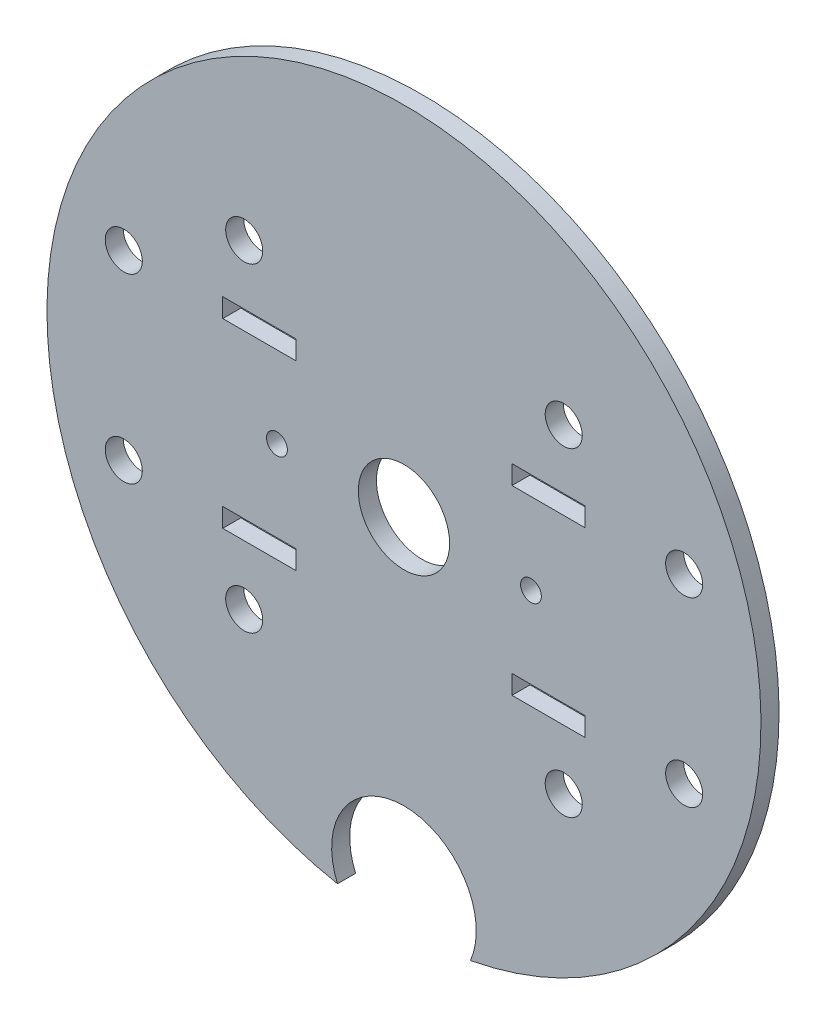
ISO-10303-21;
HEADER;
FILE_DESCRIPTION(('STEP AP214'),'2;1');
FILE_NAME('part.step','',(''),(''),'','','');
FILE_SCHEMA(('AUTOMOTIVE_DESIGN { 1 0 10303 214 1 1 1 1 }'));
ENDSEC;
DATA;
#1=APPLICATION_CONTEXT('core data for automotive mechanical design processes');
#2=APPLICATION_PROTOCOL_DEFINITION('international standard','automotive_design',2000,#1);
#3=PRODUCT_CONTEXT('',#1,'mechanical');
#4=PRODUCT('Part','Part','',(#3));
#5=PRODUCT_RELATED_PRODUCT_CATEGORY('part','',(#4));
#6=PRODUCT_DEFINITION_FORMATION('','',#4);
#7=PRODUCT_DEFINITION_CONTEXT('part definition',#1,'design');
#8=PRODUCT_DEFINITION('design','',#6,#7);
#9=PRODUCT_DEFINITION_SHAPE('','',#8);
#10=(LENGTH_UNIT() NAMED_UNIT(*) SI_UNIT(.MILLI.,.METRE.));
#11=(NAMED_UNIT(*) PLANE_ANGLE_UNIT() SI_UNIT($,.RADIAN.));
#12=(NAMED_UNIT(*) SI_UNIT($,.STERADIAN.) SOLID_ANGLE_UNIT());
#13=UNCERTAINTY_MEASURE_WITH_UNIT(LENGTH_MEASURE(1.E-05),#10,'distance_accuracy_value','');
#14=(GEOMETRIC_REPRESENTATION_CONTEXT(3) GLOBAL_UNCERTAINTY_ASSIGNED_CONTEXT((#13)) GLOBAL_UNIT_ASSIGNED_CONTEXT((#10,
#11,#12)) REPRESENTATION_CONTEXT('',''));
#15=CARTESIAN_POINT('',(0.,0.,0.));
#16=DIRECTION('',(0.,0.,1.));
#17=DIRECTION('',(1.,0.,0.));
#18=AXIS2_PLACEMENT_3D('',#15,#16,#17);
#19=CARTESIAN_POINT('',(0.,-17.8310405714632,2.));
#20=DIRECTION('',(0.,0.,-1.));
#21=DIRECTION('',(-1.,0.,0.));
#22=AXIS2_PLACEMENT_3D('',#19,#20,#21);
#23=PLANE('',#22);
#24=DIRECTION('',(-1.,0.,0.));
#25=VECTOR('',#24,1.);
#26=CARTESIAN_POINT('',(-11.95,11.1,2.));
#27=LINE('',#26,#25);
#28=CARTESIAN_POINT('',(-11.95,11.1,2.));
#29=VERTEX_POINT('',#28);
#30=CARTESIAN_POINT('',(-20.05,11.1,2.));
#31=VERTEX_POINT('',#30);
#32=EDGE_CURVE('E200',#29,#31,#27,.T.);
#33=ORIENTED_EDGE('',*,*,#32,.F.);
#34=DIRECTION('',(0.,1.,0.));
#35=VECTOR('',#34,1.);
#36=CARTESIAN_POINT('',(-11.95,11.1,2.));
#37=LINE('',#36,#35);
#38=CARTESIAN_POINT('',(-11.95,9.,2.));
#39=VERTEX_POINT('',#38);
#40=EDGE_CURVE('E208',#39,#29,#37,.T.);
#41=ORIENTED_EDGE('',*,*,#40,.F.);
#42=DIRECTION('',(1.,0.,0.));
#43=VECTOR('',#42,1.);
#44=CARTESIAN_POINT('',(-11.95,9.,2.));
#45=LINE('',#44,#43);
#46=CARTESIAN_POINT('',(-20.05,9.,2.));
#47=VERTEX_POINT('',#46);
#48=EDGE_CURVE('E205',#47,#39,#45,.T.);
#49=ORIENTED_EDGE('',*,*,#48,.F.);
#50=DIRECTION('',(0.,-1.,0.));
#51=VECTOR('',#50,1.);
#52=CARTESIAN_POINT('',(-20.05,11.1,2.));
#53=LINE('',#52,#51);
#54=EDGE_CURVE('E202',#31,#47,#53,.T.);
#55=ORIENTED_EDGE('',*,*,#54,.F.);
#56=EDGE_LOOP('',(#33,#41,#49,#55));
#57=FACE_BOUND('',#56,.T.);
#58=CARTESIAN_POINT('',(-17.6776695296637,-17.6776695296637,2.));
#59=DIRECTION('',(0.,0.,1.));
#60=DIRECTION('',(1.,0.,0.));
#61=AXIS2_PLACEMENT_3D('',#58,#59,#60);
#62=CIRCLE('',#61,2.05);
#63=CARTESIAN_POINT('',(-15.6276695296637,-17.6776695296637,2.));
#64=VERTEX_POINT('',#63);
#65=EDGE_CURVE('E280',#64,#64,#62,.T.);
#66=ORIENTED_EDGE('',*,*,#65,.F.);
#67=EDGE_LOOP('',(#66));
#68=FACE_BOUND('',#67,.T.);
#69=CARTESIAN_POINT('',(0.,0.,2.));
#70=DIRECTION('',(0.,0.,1.));
#71=DIRECTION('',(1.,0.,0.));
#72=AXIS2_PLACEMENT_3D('',#69,#70,#71);
#73=CIRCLE('',#72,5.05);
#74=CARTESIAN_POINT('',(5.05,0.,2.));
#75=VERTEX_POINT('',#74);
#76=EDGE_CURVE('E286',#75,#75,#73,.T.);
#77=ORIENTED_EDGE('',*,*,#76,.F.);
#78=EDGE_LOOP('',(#77));
#79=FACE_BOUND('',#78,.T.);
#80=DIRECTION('',(1.,0.,0.));
#81=VECTOR('',#80,1.);
#82=CARTESIAN_POINT('',(11.95,-11.1,2.));
#83=LINE('',#82,#81);
#84=CARTESIAN_POINT('',(11.95,-11.1,2.));
#85=VERTEX_POINT('',#84);
#86=CARTESIAN_POINT('',(20.05,-11.1,2.));
#87=VERTEX_POINT('',#86);
#88=EDGE_CURVE('E292',#85,#87,#83,.T.);
#89=ORIENTED_EDGE('',*,*,#88,.F.);
#90=DIRECTION('',(0.,-1.,0.));
#91=VECTOR('',#90,1.);
#92=CARTESIAN_POINT('',(11.95,-11.1,2.));
#93=LINE('',#92,#91);
#94=CARTESIAN_POINT('',(11.95,-9.,2.));
#95=VERTEX_POINT('',#94);
#96=EDGE_CURVE('E300',#95,#85,#93,.T.);
#97=ORIENTED_EDGE('',*,*,#96,.F.);
#98=DIRECTION('',(-1.,0.,0.));
#99=VECTOR('',#98,1.);
#100=CARTESIAN_POINT('',(11.95,-9.,2.));
#101=LINE('',#100,#99);
#102=CARTESIAN_POINT('',(20.05,-9.,2.));
#103=VERTEX_POINT('',#102);
#104=EDGE_CURVE('E297',#103,#95,#101,.T.);
#105=ORIENTED_EDGE('',*,*,#104,.F.);
#106=DIRECTION('',(0.,1.,0.));
#107=VECTOR('',#106,1.);
#108=CARTESIAN_POINT('',(20.05,-11.1,2.));
#109=LINE('',#108,#107);
#110=EDGE_CURVE('E294',#87,#103,#109,.T.);
#111=ORIENTED_EDGE('',*,*,#110,.F.);
#112=EDGE_LOOP('',(#89,#97,#105,#111));
#113=FACE_BOUND('',#112,.T.);
#114=CARTESIAN_POINT('',(0.,-35.6620811429264,2.));
#115=DIRECTION('',(0.,0.,-1.));
#116=DIRECTION('',(-1.,0.,0.));
#117=AXIS2_PLACEMENT_3D('',#114,#115,#116);
#118=CIRCLE('',#117,8.);
#119=CARTESIAN_POINT('',(-7.35497190989704,-38.8092049416711,2.));
#120=VERTEX_POINT('',#119);
#121=CARTESIAN_POINT('',(7.35497190989709,-38.8092049416711,2.));
#122=VERTEX_POINT('',#121);
#123=EDGE_CURVE('E323',#120,#122,#118,.T.);
#124=ORIENTED_EDGE('',*,*,#123,.T.);
#125=CARTESIAN_POINT('',(0.,0.,2.));
#126=DIRECTION('',(0.,0.,1.));
#127=DIRECTION('',(-1.,0.,0.));
#128=AXIS2_PLACEMENT_3D('',#125,#126,#127);
#129=CIRCLE('',#128,39.5);
#130=EDGE_CURVE('E326',#122,#120,#129,.T.);
#131=ORIENTED_EDGE('',*,*,#130,.T.);
#132=EDGE_LOOP('',(#124,#131));
#133=FACE_BOUND('',#132,.T.);
#134=DIRECTION('',(0.,1.,0.));
#135=VECTOR('',#134,1.);
#136=CARTESIAN_POINT('',(20.05,11.1,2.));
#137=LINE('',#136,#135);
#138=CARTESIAN_POINT('',(20.05,9.,2.));
#139=VERTEX_POINT('',#138);
#140=CARTESIAN_POINT('',(20.05,11.1,2.));
#141=VERTEX_POINT('',#140);
#142=EDGE_CURVE('E249',#139,#141,#137,.T.);
#143=ORIENTED_EDGE('',*,*,#142,.F.);
#144=DIRECTION('',(1.,0.,0.));
#145=VECTOR('',#144,1.);
#146=CARTESIAN_POINT('',(11.95,9.,2.));
#147=LINE('',#146,#145);
#148=CARTESIAN_POINT('',(11.95,9.,2.));
#149=VERTEX_POINT('',#148);
#150=EDGE_CURVE('E257',#149,#139,#147,.T.);
#151=ORIENTED_EDGE('',*,*,#150,.F.);
#152=DIRECTION('',(0.,-1.,0.));
#153=VECTOR('',#152,1.);
#154=CARTESIAN_POINT('',(11.95,11.1,2.));
#155=LINE('',#154,#153);
#156=CARTESIAN_POINT('',(11.95,11.1,2.));
#157=VERTEX_POINT('',#156);
#158=EDGE_CURVE('E254',#157,#149,#155,.T.);
#159=ORIENTED_EDGE('',*,*,#158,.F.);
#160=DIRECTION('',(-1.,0.,0.));
#161=VECTOR('',#160,1.);
#162=CARTESIAN_POINT('',(11.95,11.1,2.));
#163=LINE('',#162,#161);
#164=EDGE_CURVE('E251',#141,#157,#163,.T.);
#165=ORIENTED_EDGE('',*,*,#164,.F.);
#166=EDGE_LOOP('',(#143,#151,#159,#165));
#167=FACE_BOUND('',#166,.T.);
#168=CARTESIAN_POINT('',(-17.6776695296637,17.6776695296637,2.));
#169=DIRECTION('',(0.,0.,1.));
#170=DIRECTION('',(1.,0.,0.));
#171=AXIS2_PLACEMENT_3D('',#168,#169,#170);
#172=CIRCLE('',#171,2.05);
#173=CARTESIAN_POINT('',(-15.6276695296637,17.6776695296637,2.));
#174=VERTEX_POINT('',#173);
#175=EDGE_CURVE('E243',#174,#174,#172,.T.);
#176=ORIENTED_EDGE('',*,*,#175,.F.);
#177=EDGE_LOOP('',(#176));
#178=FACE_BOUND('',#177,.T.);
#179=CARTESIAN_POINT('',(17.6776695296637,17.6776695296637,2.));
#180=DIRECTION('',(0.,0.,1.));
#181=DIRECTION('',(1.,0.,0.));
#182=AXIS2_PLACEMENT_3D('',#179,#180,#181);
#183=CIRCLE('',#182,2.05);
#184=CARTESIAN_POINT('',(19.7276695296637,17.6776695296637,2.));
#185=VERTEX_POINT('',#184);
#186=EDGE_CURVE('E237',#185,#185,#183,.T.);
#187=ORIENTED_EDGE('',*,*,#186,.F.);
#188=EDGE_LOOP('',(#187));
#189=FACE_BOUND('',#188,.T.);
#190=CARTESIAN_POINT('',(17.6776695296637,-17.6776695296637,2.));
#191=DIRECTION('',(0.,0.,1.));
#192=DIRECTION('',(1.,0.,0.));
#193=AXIS2_PLACEMENT_3D('',#190,#191,#192);
#194=CIRCLE('',#193,2.05);
#195=CARTESIAN_POINT('',(19.7276695296637,-17.6776695296637,2.));
#196=VERTEX_POINT('',#195);
#197=EDGE_CURVE('E231',#196,#196,#194,.T.);
#198=ORIENTED_EDGE('',*,*,#197,.F.);
#199=EDGE_LOOP('',(#198));
#200=FACE_BOUND('',#199,.T.);
#201=DIRECTION('',(1.,0.,0.));
#202=VECTOR('',#201,1.);
#203=CARTESIAN_POINT('',(-11.95,-11.1,2.));
#204=LINE('',#203,#202);
#205=CARTESIAN_POINT('',(-20.05,-11.1,2.));
#206=VERTEX_POINT('',#205);
#207=CARTESIAN_POINT('',(-11.95,-11.1,2.));
#208=VERTEX_POINT('',#207);
#209=EDGE_CURVE('E161',#206,#208,#204,.T.);
#210=ORIENTED_EDGE('',*,*,#209,.F.);
#211=DIRECTION('',(0.,-1.,0.));
#212=VECTOR('',#211,1.);
#213=CARTESIAN_POINT('',(-20.05,-11.1,2.));
#214=LINE('',#213,#212);
#215=CARTESIAN_POINT('',(-20.05,-9.,2.));
#216=VERTEX_POINT('',#215);
#217=EDGE_CURVE('E184',#216,#206,#214,.T.);
#218=ORIENTED_EDGE('',*,*,#217,.F.);
#219=DIRECTION('',(-1.,0.,0.));
#220=VECTOR('',#219,1.);
#221=CARTESIAN_POINT('',(-11.95,-9.,2.));
#222=LINE('',#221,#220);
#223=CARTESIAN_POINT('',(-11.95,-9.,2.));
#224=VERTEX_POINT('',#223);
#225=EDGE_CURVE('E182',#224,#216,#222,.T.);
#226=ORIENTED_EDGE('',*,*,#225,.F.);
#227=DIRECTION('',(0.,1.,0.));
#228=VECTOR('',#227,1.);
#229=CARTESIAN_POINT('',(-11.95,-11.1,2.));
#230=LINE('',#229,#228);
#231=EDGE_CURVE('E169',#208,#224,#230,.T.);
#232=ORIENTED_EDGE('',*,*,#231,.F.);
#233=EDGE_LOOP('',(#210,#218,#226,#232));
#234=FACE_BOUND('',#233,.T.);
#235=CARTESIAN_POINT('',(31.,10.05,2.));
#236=DIRECTION('',(0.,0.,1.));
#237=DIRECTION('',(1.,0.,0.));
#238=AXIS2_PLACEMENT_3D('',#235,#236,#237);
#239=CIRCLE('',#238,2.04999999999999);
#240=CARTESIAN_POINT('',(33.05,10.05,2.));
#241=VERTEX_POINT('',#240);
#242=EDGE_CURVE('E190',#241,#241,#239,.T.);
#243=ORIENTED_EDGE('',*,*,#242,.F.);
#244=EDGE_LOOP('',(#243));
#245=FACE_BOUND('',#244,.T.);
#246=CARTESIAN_POINT('',(31.,-10.05,2.));
#247=DIRECTION('',(0.,0.,1.));
#248=DIRECTION('',(-1.,0.,0.));
#249=AXIS2_PLACEMENT_3D('',#246,#247,#248);
#250=CIRCLE('',#249,2.04999999999999);
#251=CARTESIAN_POINT('',(28.95,-10.05,2.));
#252=VERTEX_POINT('',#251);
#253=EDGE_CURVE('E405',#252,#252,#250,.T.);
#254=ORIENTED_EDGE('',*,*,#253,.F.);
#255=EDGE_LOOP('',(#254));
#256=FACE_BOUND('',#255,.T.);
#257=CARTESIAN_POINT('',(-31.,-10.05,2.));
#258=DIRECTION('',(0.,0.,1.));
#259=DIRECTION('',(1.,0.,0.));
#260=AXIS2_PLACEMENT_3D('',#257,#258,#259);
#261=CIRCLE('',#260,2.04999999999999);
#262=CARTESIAN_POINT('',(-28.95,-10.05,2.));
#263=VERTEX_POINT('',#262);
#264=EDGE_CURVE('E400',#263,#263,#261,.T.);
#265=ORIENTED_EDGE('',*,*,#264,.F.);
#266=EDGE_LOOP('',(#265));
#267=FACE_BOUND('',#266,.T.);
#268=CARTESIAN_POINT('',(-31.,10.05,2.));
#269=DIRECTION('',(0.,0.,1.));
#270=DIRECTION('',(-1.,0.,0.));
#271=AXIS2_PLACEMENT_3D('',#268,#269,#270);
#272=CIRCLE('',#271,2.04999999999999);
#273=CARTESIAN_POINT('',(-33.05,10.05,2.));
#274=VERTEX_POINT('',#273);
#275=EDGE_CURVE('E395',#274,#274,#272,.T.);
#276=ORIENTED_EDGE('',*,*,#275,.F.);
#277=EDGE_LOOP('',(#276));
#278=FACE_BOUND('',#277,.T.);
#279=CARTESIAN_POINT('',(-14.05,0.,2.));
#280=DIRECTION('',(0.,0.,1.));
#281=DIRECTION('',(1.,0.,0.));
#282=AXIS2_PLACEMENT_3D('',#279,#280,#281);
#283=CIRCLE('',#282,1.15);
#284=CARTESIAN_POINT('',(-12.9,0.,2.));
#285=VERTEX_POINT('',#284);
#286=EDGE_CURVE('E390',#285,#285,#283,.T.);
#287=ORIENTED_EDGE('',*,*,#286,.F.);
#288=EDGE_LOOP('',(#287));
#289=FACE_BOUND('',#288,.T.);
#290=CARTESIAN_POINT('',(14.05,0.,2.));
#291=DIRECTION('',(0.,0.,1.));
#292=DIRECTION('',(1.,0.,0.));
#293=AXIS2_PLACEMENT_3D('',#290,#291,#292);
#294=CIRCLE('',#293,1.15);
#295=CARTESIAN_POINT('',(15.2,0.,2.));
#296=VERTEX_POINT('',#295);
#297=EDGE_CURVE('E384',#296,#296,#294,.T.);
#298=ORIENTED_EDGE('',*,*,#297,.F.);
#299=EDGE_LOOP('',(#298));
#300=FACE_BOUND('',#299,.T.);
#301=ADVANCED_FACE('F36',(#57,#68,#79,#113,#133,#167,#178,#189,#200,#234,#245,#256,#267,#278,
#289,#300),#23,.F.);
#302=CARTESIAN_POINT('',(0.,-17.8310405714632,0.));
#303=DIRECTION('',(0.,0.,-1.));
#304=DIRECTION('',(-1.,0.,0.));
#305=AXIS2_PLACEMENT_3D('',#302,#303,#304);
#306=PLANE('',#305);
#307=CARTESIAN_POINT('',(-14.05,0.,0.));
#308=DIRECTION('',(0.,0.,1.));
#309=DIRECTION('',(1.,0.,0.));
#310=AXIS2_PLACEMENT_3D('',#307,#308,#309);
#311=CIRCLE('',#310,1.15);
#312=CARTESIAN_POINT('',(-12.9,0.,0.));
#313=VERTEX_POINT('',#312);
#314=EDGE_CURVE('E387',#313,#313,#311,.T.);
#315=ORIENTED_EDGE('',*,*,#314,.T.);
#316=EDGE_LOOP('',(#315));
#317=FACE_BOUND('',#316,.T.);
#318=CARTESIAN_POINT('',(-31.,-10.05,0.));
#319=DIRECTION('',(0.,0.,1.));
#320=DIRECTION('',(1.,0.,0.));
#321=AXIS2_PLACEMENT_3D('',#318,#319,#320);
#322=CIRCLE('',#321,2.04999999999999);
#323=CARTESIAN_POINT('',(-28.95,-10.05,0.));
#324=VERTEX_POINT('',#323);
#325=EDGE_CURVE('E398',#324,#324,#322,.T.);
#326=ORIENTED_EDGE('',*,*,#325,.T.);
#327=EDGE_LOOP('',(#326));
#328=FACE_BOUND('',#327,.T.);
#329=CARTESIAN_POINT('',(31.,10.05,0.));
#330=DIRECTION('',(0.,0.,1.));
#331=DIRECTION('',(1.,0.,0.));
#332=AXIS2_PLACEMENT_3D('',#329,#330,#331);
#333=CIRCLE('',#332,2.04999999999999);
#334=CARTESIAN_POINT('',(33.05,10.05,0.));
#335=VERTEX_POINT('',#334);
#336=EDGE_CURVE('E408',#335,#335,#333,.T.);
#337=ORIENTED_EDGE('',*,*,#336,.T.);
#338=EDGE_LOOP('',(#337));
#339=FACE_BOUND('',#338,.T.);
#340=CARTESIAN_POINT('',(17.6776695296637,17.6776695296637,0.));
#341=DIRECTION('',(0.,0.,1.));
#342=DIRECTION('',(1.,0.,0.));
#343=AXIS2_PLACEMENT_3D('',#340,#341,#342);
#344=CIRCLE('',#343,2.05);
#345=CARTESIAN_POINT('',(19.7276695296637,17.6776695296637,0.));
#346=VERTEX_POINT('',#345);
#347=EDGE_CURVE('E234',#346,#346,#344,.T.);
#348=ORIENTED_EDGE('',*,*,#347,.T.);
#349=EDGE_LOOP('',(#348));
#350=FACE_BOUND('',#349,.T.);
#351=DIRECTION('',(1.,0.,0.));
#352=VECTOR('',#351,1.);
#353=CARTESIAN_POINT('',(11.95,9.,0.));
#354=LINE('',#353,#352);
#355=CARTESIAN_POINT('',(11.95,9.,0.));
#356=VERTEX_POINT('',#355);
#357=CARTESIAN_POINT('',(20.05,9.,0.));
#358=VERTEX_POINT('',#357);
#359=EDGE_CURVE('E252',#356,#358,#354,.T.);
#360=ORIENTED_EDGE('',*,*,#359,.T.);
#361=DIRECTION('',(0.,1.,0.));
#362=VECTOR('',#361,1.);
#363=CARTESIAN_POINT('',(20.05,11.1,0.));
#364=LINE('',#363,#362);
#365=CARTESIAN_POINT('',(20.05,11.1,0.));
#366=VERTEX_POINT('',#365);
#367=EDGE_CURVE('E246',#358,#366,#364,.T.);
#368=ORIENTED_EDGE('',*,*,#367,.T.);
#369=DIRECTION('',(-1.,0.,0.));
#370=VECTOR('',#369,1.);
#371=CARTESIAN_POINT('',(11.95,11.1,0.));
#372=LINE('',#371,#370);
#373=CARTESIAN_POINT('',(11.95,11.1,0.));
#374=VERTEX_POINT('',#373);
#375=EDGE_CURVE('E262',#366,#374,#372,.T.);
#376=ORIENTED_EDGE('',*,*,#375,.T.);
#377=DIRECTION('',(0.,-1.,0.));
#378=VECTOR('',#377,1.);
#379=CARTESIAN_POINT('',(11.95,11.1,0.));
#380=LINE('',#379,#378);
#381=EDGE_CURVE('E265',#374,#356,#380,.T.);
#382=ORIENTED_EDGE('',*,*,#381,.T.);
#383=EDGE_LOOP('',(#360,#368,#376,#382));
#384=FACE_BOUND('',#383,.T.);
#385=CARTESIAN_POINT('',(-17.6776695296637,-17.6776695296637,0.));
#386=DIRECTION('',(0.,0.,1.));
#387=DIRECTION('',(1.,0.,0.));
#388=AXIS2_PLACEMENT_3D('',#385,#386,#387);
#389=CIRCLE('',#388,2.05);
#390=CARTESIAN_POINT('',(-15.6276695296637,-17.6776695296637,0.));
#391=VERTEX_POINT('',#390);
#392=EDGE_CURVE('E279',#391,#391,#389,.T.);
#393=ORIENTED_EDGE('',*,*,#392,.T.);
#394=EDGE_LOOP('',(#393));
#395=FACE_BOUND('',#394,.T.);
#396=DIRECTION('',(0.,-1.,0.));
#397=VECTOR('',#396,1.);
#398=CARTESIAN_POINT('',(11.95,-11.1,0.));
#399=LINE('',#398,#397);
#400=CARTESIAN_POINT('',(11.95,-9.,0.));
#401=VERTEX_POINT('',#400);
#402=CARTESIAN_POINT('',(11.95,-11.1,0.));
#403=VERTEX_POINT('',#402);
#404=EDGE_CURVE('E295',#401,#403,#399,.T.);
#405=ORIENTED_EDGE('',*,*,#404,.T.);
#406=DIRECTION('',(1.,0.,0.));
#407=VECTOR('',#406,1.);
#408=CARTESIAN_POINT('',(11.95,-11.1,0.));
#409=LINE('',#408,#407);
#410=CARTESIAN_POINT('',(20.05,-11.1,0.));
#411=VERTEX_POINT('',#410);
#412=EDGE_CURVE('E289',#403,#411,#409,.T.);
#413=ORIENTED_EDGE('',*,*,#412,.T.);
#414=DIRECTION('',(0.,1.,0.));
#415=VECTOR('',#414,1.);
#416=CARTESIAN_POINT('',(20.05,-11.1,0.));
#417=LINE('',#416,#415);
#418=CARTESIAN_POINT('',(20.05,-9.,0.));
#419=VERTEX_POINT('',#418);
#420=EDGE_CURVE('E305',#411,#419,#417,.T.);
#421=ORIENTED_EDGE('',*,*,#420,.T.);
#422=DIRECTION('',(-1.,0.,0.));
#423=VECTOR('',#422,1.);
#424=CARTESIAN_POINT('',(11.95,-9.,0.));
#425=LINE('',#424,#423);
#426=EDGE_CURVE('E308',#419,#401,#425,.T.);
#427=ORIENTED_EDGE('',*,*,#426,.T.);
#428=EDGE_LOOP('',(#405,#413,#421,#427));
#429=FACE_BOUND('',#428,.T.);
#430=CARTESIAN_POINT('',(0.,-35.6620811429264,0.));
#431=DIRECTION('',(0.,0.,-1.));
#432=DIRECTION('',(-1.,0.,0.));
#433=AXIS2_PLACEMENT_3D('',#430,#431,#432);
#434=CIRCLE('',#433,8.);
#435=CARTESIAN_POINT('',(-7.35497190989704,-38.8092049416711,0.));
#436=VERTEX_POINT('',#435);
#437=CARTESIAN_POINT('',(7.35497190989709,-38.8092049416711,0.));
#438=VERTEX_POINT('',#437);
#439=EDGE_CURVE('E322',#436,#438,#434,.T.);
#440=ORIENTED_EDGE('',*,*,#439,.F.);
#441=CARTESIAN_POINT('',(0.,0.,0.));
#442=DIRECTION('',(0.,0.,1.));
#443=DIRECTION('',(-1.,0.,0.));
#444=AXIS2_PLACEMENT_3D('',#441,#442,#443);
#445=CIRCLE('',#444,39.5);
#446=EDGE_CURVE('E327',#438,#436,#445,.T.);
#447=ORIENTED_EDGE('',*,*,#446,.F.);
#448=EDGE_LOOP('',(#440,#447));
#449=FACE_BOUND('',#448,.T.);
#450=CARTESIAN_POINT('',(0.,0.,0.));
#451=DIRECTION('',(0.,0.,1.));
#452=DIRECTION('',(1.,0.,0.));
#453=AXIS2_PLACEMENT_3D('',#450,#451,#452);
#454=CIRCLE('',#453,5.05);
#455=CARTESIAN_POINT('',(5.05,0.,0.));
#456=VERTEX_POINT('',#455);
#457=EDGE_CURVE('E283',#456,#456,#454,.T.);
#458=ORIENTED_EDGE('',*,*,#457,.T.);
#459=EDGE_LOOP('',(#458));
#460=FACE_BOUND('',#459,.T.);
#461=CARTESIAN_POINT('',(-17.6776695296637,17.6776695296637,0.));
#462=DIRECTION('',(0.,0.,1.));
#463=DIRECTION('',(1.,0.,0.));
#464=AXIS2_PLACEMENT_3D('',#461,#462,#463);
#465=CIRCLE('',#464,2.05);
#466=CARTESIAN_POINT('',(-15.6276695296637,17.6776695296637,0.));
#467=VERTEX_POINT('',#466);
#468=EDGE_CURVE('E240',#467,#467,#465,.T.);
#469=ORIENTED_EDGE('',*,*,#468,.T.);
#470=EDGE_LOOP('',(#469));
#471=FACE_BOUND('',#470,.T.);
#472=CARTESIAN_POINT('',(17.6776695296637,-17.6776695296637,0.));
#473=DIRECTION('',(0.,0.,1.));
#474=DIRECTION('',(1.,0.,0.));
#475=AXIS2_PLACEMENT_3D('',#472,#473,#474);
#476=CIRCLE('',#475,2.05);
#477=CARTESIAN_POINT('',(19.7276695296637,-17.6776695296637,0.));
#478=VERTEX_POINT('',#477);
#479=EDGE_CURVE('E230',#478,#478,#476,.T.);
#480=ORIENTED_EDGE('',*,*,#479,.T.);
#481=EDGE_LOOP('',(#480));
#482=FACE_BOUND('',#481,.T.);
#483=DIRECTION('',(0.,1.,0.));
#484=VECTOR('',#483,1.);
#485=CARTESIAN_POINT('',(-11.95,11.1,0.));
#486=LINE('',#485,#484);
#487=CARTESIAN_POINT('',(-11.95,9.,0.));
#488=VERTEX_POINT('',#487);
#489=CARTESIAN_POINT('',(-11.95,11.1,0.));
#490=VERTEX_POINT('',#489);
#491=EDGE_CURVE('E203',#488,#490,#486,.T.);
#492=ORIENTED_EDGE('',*,*,#491,.T.);
#493=DIRECTION('',(-1.,0.,0.));
#494=VECTOR('',#493,1.);
#495=CARTESIAN_POINT('',(-11.95,11.1,0.));
#496=LINE('',#495,#494);
#497=CARTESIAN_POINT('',(-20.05,11.1,0.));
#498=VERTEX_POINT('',#497);
#499=EDGE_CURVE('E177',#490,#498,#496,.T.);
#500=ORIENTED_EDGE('',*,*,#499,.T.);
#501=DIRECTION('',(0.,-1.,0.));
#502=VECTOR('',#501,1.);
#503=CARTESIAN_POINT('',(-20.05,11.1,0.));
#504=LINE('',#503,#502);
#505=CARTESIAN_POINT('',(-20.05,9.,0.));
#506=VERTEX_POINT('',#505);
#507=EDGE_CURVE('E213',#498,#506,#504,.T.);
#508=ORIENTED_EDGE('',*,*,#507,.T.);
#509=DIRECTION('',(1.,0.,0.));
#510=VECTOR('',#509,1.);
#511=CARTESIAN_POINT('',(-11.95,9.,0.));
#512=LINE('',#511,#510);
#513=EDGE_CURVE('E216',#506,#488,#512,.T.);
#514=ORIENTED_EDGE('',*,*,#513,.T.);
#515=EDGE_LOOP('',(#492,#500,#508,#514));
#516=FACE_BOUND('',#515,.T.);
#517=DIRECTION('',(0.,-1.,0.));
#518=VECTOR('',#517,1.);
#519=CARTESIAN_POINT('',(-20.05,-11.1,0.));
#520=LINE('',#519,#518);
#521=CARTESIAN_POINT('',(-20.05,-9.,0.));
#522=VERTEX_POINT('',#521);
#523=CARTESIAN_POINT('',(-20.05,-11.1,0.));
#524=VERTEX_POINT('',#523);
#525=EDGE_CURVE('E170',#522,#524,#520,.T.);
#526=ORIENTED_EDGE('',*,*,#525,.T.);
#527=DIRECTION('',(1.,0.,0.));
#528=VECTOR('',#527,1.);
#529=CARTESIAN_POINT('',(-11.95,-11.1,0.));
#530=LINE('',#529,#528);
#531=CARTESIAN_POINT('',(-11.95,-11.1,0.));
#532=VERTEX_POINT('',#531);
#533=EDGE_CURVE('E59',#524,#532,#530,.T.);
#534=ORIENTED_EDGE('',*,*,#533,.T.);
#535=DIRECTION('',(0.,1.,0.));
#536=VECTOR('',#535,1.);
#537=CARTESIAN_POINT('',(-11.95,-11.1,0.));
#538=LINE('',#537,#536);
#539=CARTESIAN_POINT('',(-11.95,-9.,0.));
#540=VERTEX_POINT('',#539);
#541=EDGE_CURVE('E176',#532,#540,#538,.T.);
#542=ORIENTED_EDGE('',*,*,#541,.T.);
#543=DIRECTION('',(-1.,0.,0.));
#544=VECTOR('',#543,1.);
#545=CARTESIAN_POINT('',(-11.95,-9.,0.));
#546=LINE('',#545,#544);
#547=EDGE_CURVE('E192',#540,#522,#546,.T.);
#548=ORIENTED_EDGE('',*,*,#547,.T.);
#549=EDGE_LOOP('',(#526,#534,#542,#548));
#550=FACE_BOUND('',#549,.T.);
#551=CARTESIAN_POINT('',(31.,-10.05,0.));
#552=DIRECTION('',(0.,0.,1.));
#553=DIRECTION('',(-1.,0.,0.));
#554=AXIS2_PLACEMENT_3D('',#551,#552,#553);
#555=CIRCLE('',#554,2.04999999999999);
#556=CARTESIAN_POINT('',(28.95,-10.05,0.));
#557=VERTEX_POINT('',#556);
#558=EDGE_CURVE('E375',#557,#557,#555,.T.);
#559=ORIENTED_EDGE('',*,*,#558,.T.);
#560=EDGE_LOOP('',(#559));
#561=FACE_BOUND('',#560,.T.);
#562=CARTESIAN_POINT('',(-31.,10.05,0.));
#563=DIRECTION('',(0.,0.,1.));
#564=DIRECTION('',(-1.,0.,0.));
#565=AXIS2_PLACEMENT_3D('',#562,#563,#564);
#566=CIRCLE('',#565,2.04999999999999);
#567=CARTESIAN_POINT('',(-33.05,10.05,0.));
#568=VERTEX_POINT('',#567);
#569=EDGE_CURVE('E379',#568,#568,#566,.T.);
#570=ORIENTED_EDGE('',*,*,#569,.T.);
#571=EDGE_LOOP('',(#570));
#572=FACE_BOUND('',#571,.T.);
#573=CARTESIAN_POINT('',(14.05,0.,0.));
#574=DIRECTION('',(0.,0.,1.));
#575=DIRECTION('',(1.,0.,0.));
#576=AXIS2_PLACEMENT_3D('',#573,#574,#575);
#577=CIRCLE('',#576,1.15);
#578=CARTESIAN_POINT('',(15.2,0.,0.));
#579=VERTEX_POINT('',#578);
#580=EDGE_CURVE('E382',#579,#579,#577,.T.);
#581=ORIENTED_EDGE('',*,*,#580,.T.);
#582=EDGE_LOOP('',(#581));
#583=FACE_BOUND('',#582,.T.);
#584=ADVANCED_FACE('F339',(#317,#328,#339,#350,#384,#395,#429,#449,#460,#471,#482,#516,#550,
#561,#572,#583),#306,.T.);
#585=CARTESIAN_POINT('',(0.,-35.6620811429264,2.));
#586=DIRECTION('',(0.,0.,-1.));
#587=DIRECTION('',(-1.,0.,0.));
#588=AXIS2_PLACEMENT_3D('',#585,#586,#587);
#589=CYLINDRICAL_SURFACE('',#588,8.);
#590=ORIENTED_EDGE('',*,*,#439,.T.);
#591=DIRECTION('',(0.,0.,-1.));
#592=VECTOR('',#591,1.);
#593=CARTESIAN_POINT('',(7.35497190989709,-38.8092049416711,2.));
#594=LINE('',#593,#592);
#595=EDGE_CURVE('E11',#122,#438,#594,.T.);
#596=ORIENTED_EDGE('',*,*,#595,.F.);
#597=ORIENTED_EDGE('',*,*,#123,.F.);
#598=DIRECTION('',(0.,0.,-1.));
#599=VECTOR('',#598,1.);
#600=CARTESIAN_POINT('',(-7.35497190989704,-38.8092049416711,2.));
#601=LINE('',#600,#599);
#602=EDGE_CURVE('E44',#120,#436,#601,.T.);
#603=ORIENTED_EDGE('',*,*,#602,.T.);
#604=EDGE_LOOP('',(#590,#596,#597,#603));
#605=FACE_BOUND('',#604,.T.);
#606=ADVANCED_FACE('F38',(#605),#589,.F.);
#607=CARTESIAN_POINT('',(0.,0.,2.));
#608=DIRECTION('',(0.,0.,-1.));
#609=DIRECTION('',(-1.,0.,0.));
#610=AXIS2_PLACEMENT_3D('',#607,#608,#609);
#611=CYLINDRICAL_SURFACE('',#610,39.5);
#612=ORIENTED_EDGE('',*,*,#446,.T.);
#613=ORIENTED_EDGE('',*,*,#602,.F.);
#614=ORIENTED_EDGE('',*,*,#130,.F.);
#615=ORIENTED_EDGE('',*,*,#595,.T.);
#616=EDGE_LOOP('',(#612,#613,#614,#615));
#617=FACE_BOUND('',#616,.T.);
#618=ADVANCED_FACE('F341',(#617),#611,.T.);
#619=CARTESIAN_POINT('',(11.95,-11.1,2.));
#620=DIRECTION('',(0.,1.,0.));
#621=DIRECTION('',(0.,0.,1.));
#622=AXIS2_PLACEMENT_3D('',#619,#620,#621);
#623=PLANE('',#622);
#624=ORIENTED_EDGE('',*,*,#412,.F.);
#625=DIRECTION('',(0.,0.,-1.));
#626=VECTOR('',#625,1.);
#627=CARTESIAN_POINT('',(11.95,-11.1,2.));
#628=LINE('',#627,#626);
#629=EDGE_CURVE('E302',#85,#403,#628,.T.);
#630=ORIENTED_EDGE('',*,*,#629,.F.);
#631=ORIENTED_EDGE('',*,*,#88,.T.);
#632=DIRECTION('',(0.,0.,-1.));
#633=VECTOR('',#632,1.);
#634=CARTESIAN_POINT('',(20.05,-11.1,2.));
#635=LINE('',#634,#633);
#636=EDGE_CURVE('E319',#87,#411,#635,.T.);
#637=ORIENTED_EDGE('',*,*,#636,.T.);
#638=EDGE_LOOP('',(#624,#630,#631,#637));
#639=FACE_BOUND('',#638,.T.);
#640=ADVANCED_FACE('F497',(#639),#623,.T.);
#641=CARTESIAN_POINT('',(20.05,-11.1,2.));
#642=DIRECTION('',(-1.,0.,0.));
#643=DIRECTION('',(0.,0.,1.));
#644=AXIS2_PLACEMENT_3D('',#641,#642,#643);
#645=PLANE('',#644);
#646=ORIENTED_EDGE('',*,*,#420,.F.);
#647=ORIENTED_EDGE('',*,*,#636,.F.);
#648=ORIENTED_EDGE('',*,*,#110,.T.);
#649=DIRECTION('',(0.,0.,-1.));
#650=VECTOR('',#649,1.);
#651=CARTESIAN_POINT('',(20.05,-9.,2.));
#652=LINE('',#651,#650);
#653=EDGE_CURVE('E317',#103,#419,#652,.T.);
#654=ORIENTED_EDGE('',*,*,#653,.T.);
#655=EDGE_LOOP('',(#646,#647,#648,#654));
#656=FACE_BOUND('',#655,.T.);
#657=ADVANCED_FACE('F493',(#656),#645,.T.);
#658=CARTESIAN_POINT('',(11.95,-9.,2.));
#659=DIRECTION('',(0.,-1.,0.));
#660=DIRECTION('',(0.,0.,-1.));
#661=AXIS2_PLACEMENT_3D('',#658,#659,#660);
#662=PLANE('',#661);
#663=ORIENTED_EDGE('',*,*,#426,.F.);
#664=ORIENTED_EDGE('',*,*,#653,.F.);
#665=ORIENTED_EDGE('',*,*,#104,.T.);
#666=DIRECTION('',(0.,0.,-1.));
#667=VECTOR('',#666,1.);
#668=CARTESIAN_POINT('',(11.95,-9.,2.));
#669=LINE('',#668,#667);
#670=EDGE_CURVE('E315',#95,#401,#669,.T.);
#671=ORIENTED_EDGE('',*,*,#670,.T.);
#672=EDGE_LOOP('',(#663,#664,#665,#671));
#673=FACE_BOUND('',#672,.T.);
#674=ADVANCED_FACE('F489',(#673),#662,.T.);
#675=CARTESIAN_POINT('',(11.95,-11.1,2.));
#676=DIRECTION('',(1.,0.,0.));
#677=DIRECTION('',(0.,0.,-1.));
#678=AXIS2_PLACEMENT_3D('',#675,#676,#677);
#679=PLANE('',#678);
#680=ORIENTED_EDGE('',*,*,#404,.F.);
#681=ORIENTED_EDGE('',*,*,#670,.F.);
#682=ORIENTED_EDGE('',*,*,#96,.T.);
#683=ORIENTED_EDGE('',*,*,#629,.T.);
#684=EDGE_LOOP('',(#680,#681,#682,#683));
#685=FACE_BOUND('',#684,.T.);
#686=ADVANCED_FACE('F485',(#685),#679,.T.);
#687=CARTESIAN_POINT('',(0.,0.,2.));
#688=DIRECTION('',(0.,0.,-1.));
#689=DIRECTION('',(-1.,0.,0.));
#690=AXIS2_PLACEMENT_3D('',#687,#688,#689);
#691=CYLINDRICAL_SURFACE('',#690,5.05);
#692=ORIENTED_EDGE('',*,*,#76,.T.);
#693=EDGE_LOOP('',(#692));
#694=FACE_BOUND('',#693,.T.);
#695=ORIENTED_EDGE('',*,*,#457,.F.);
#696=EDGE_LOOP('',(#695));
#697=FACE_BOUND('',#696,.T.);
#698=ADVANCED_FACE('F481',(#694,#697),#691,.F.);
#699=CARTESIAN_POINT('',(-17.6776695296637,-17.6776695296637,2.));
#700=DIRECTION('',(0.,0.,-1.));
#701=DIRECTION('',(-1.,0.,0.));
#702=AXIS2_PLACEMENT_3D('',#699,#700,#701);
#703=CYLINDRICAL_SURFACE('',#702,2.05);
#704=ORIENTED_EDGE('',*,*,#65,.T.);
#705=EDGE_LOOP('',(#704));
#706=FACE_BOUND('',#705,.T.);
#707=ORIENTED_EDGE('',*,*,#392,.F.);
#708=EDGE_LOOP('',(#707));
#709=FACE_BOUND('',#708,.T.);
#710=ADVANCED_FACE('F477',(#706,#709),#703,.F.);
#711=CARTESIAN_POINT('',(20.05,11.1,2.));
#712=DIRECTION('',(-1.,0.,0.));
#713=DIRECTION('',(0.,0.,1.));
#714=AXIS2_PLACEMENT_3D('',#711,#712,#713);
#715=PLANE('',#714);
#716=ORIENTED_EDGE('',*,*,#367,.F.);
#717=DIRECTION('',(0.,0.,-1.));
#718=VECTOR('',#717,1.);
#719=CARTESIAN_POINT('',(20.05,9.,2.));
#720=LINE('',#719,#718);
#721=EDGE_CURVE('E259',#139,#358,#720,.T.);
#722=ORIENTED_EDGE('',*,*,#721,.F.);
#723=ORIENTED_EDGE('',*,*,#142,.T.);
#724=DIRECTION('',(0.,0.,-1.));
#725=VECTOR('',#724,1.);
#726=CARTESIAN_POINT('',(20.05,11.1,2.));
#727=LINE('',#726,#725);
#728=EDGE_CURVE('E276',#141,#366,#727,.T.);
#729=ORIENTED_EDGE('',*,*,#728,.T.);
#730=EDGE_LOOP('',(#716,#722,#723,#729));
#731=FACE_BOUND('',#730,.T.);
#732=ADVANCED_FACE('F473',(#731),#715,.T.);
#733=CARTESIAN_POINT('',(11.95,11.1,2.));
#734=DIRECTION('',(0.,-1.,0.));
#735=DIRECTION('',(0.,0.,-1.));
#736=AXIS2_PLACEMENT_3D('',#733,#734,#735);
#737=PLANE('',#736);
#738=ORIENTED_EDGE('',*,*,#375,.F.);
#739=ORIENTED_EDGE('',*,*,#728,.F.);
#740=ORIENTED_EDGE('',*,*,#164,.T.);
#741=DIRECTION('',(0.,0.,-1.));
#742=VECTOR('',#741,1.);
#743=CARTESIAN_POINT('',(11.95,11.1,2.));
#744=LINE('',#743,#742);
#745=EDGE_CURVE('E274',#157,#374,#744,.T.);
#746=ORIENTED_EDGE('',*,*,#745,.T.);
#747=EDGE_LOOP('',(#738,#739,#740,#746));
#748=FACE_BOUND('',#747,.T.);
#749=ADVANCED_FACE('F469',(#748),#737,.T.);
#750=CARTESIAN_POINT('',(11.95,11.1,2.));
#751=DIRECTION('',(1.,0.,0.));
#752=DIRECTION('',(0.,0.,-1.));
#753=AXIS2_PLACEMENT_3D('',#750,#751,#752);
#754=PLANE('',#753);
#755=ORIENTED_EDGE('',*,*,#381,.F.);
#756=ORIENTED_EDGE('',*,*,#745,.F.);
#757=ORIENTED_EDGE('',*,*,#158,.T.);
#758=DIRECTION('',(0.,0.,-1.));
#759=VECTOR('',#758,1.);
#760=CARTESIAN_POINT('',(11.95,9.,2.));
#761=LINE('',#760,#759);
#762=EDGE_CURVE('E272',#149,#356,#761,.T.);
#763=ORIENTED_EDGE('',*,*,#762,.T.);
#764=EDGE_LOOP('',(#755,#756,#757,#763));
#765=FACE_BOUND('',#764,.T.);
#766=ADVANCED_FACE('F465',(#765),#754,.T.);
#767=CARTESIAN_POINT('',(11.95,9.,2.));
#768=DIRECTION('',(0.,1.,0.));
#769=DIRECTION('',(0.,0.,1.));
#770=AXIS2_PLACEMENT_3D('',#767,#768,#769);
#771=PLANE('',#770);
#772=ORIENTED_EDGE('',*,*,#359,.F.);
#773=ORIENTED_EDGE('',*,*,#762,.F.);
#774=ORIENTED_EDGE('',*,*,#150,.T.);
#775=ORIENTED_EDGE('',*,*,#721,.T.);
#776=EDGE_LOOP('',(#772,#773,#774,#775));
#777=FACE_BOUND('',#776,.T.);
#778=ADVANCED_FACE('F461',(#777),#771,.T.);
#779=CARTESIAN_POINT('',(-17.6776695296637,17.6776695296637,2.));
#780=DIRECTION('',(0.,0.,-1.));
#781=DIRECTION('',(-1.,0.,0.));
#782=AXIS2_PLACEMENT_3D('',#779,#780,#781);
#783=CYLINDRICAL_SURFACE('',#782,2.05);
#784=ORIENTED_EDGE('',*,*,#175,.T.);
#785=EDGE_LOOP('',(#784));
#786=FACE_BOUND('',#785,.T.);
#787=ORIENTED_EDGE('',*,*,#468,.F.);
#788=EDGE_LOOP('',(#787));
#789=FACE_BOUND('',#788,.T.);
#790=ADVANCED_FACE('F457',(#786,#789),#783,.F.);
#791=CARTESIAN_POINT('',(17.6776695296637,17.6776695296637,2.));
#792=DIRECTION('',(0.,0.,-1.));
#793=DIRECTION('',(-1.,0.,0.));
#794=AXIS2_PLACEMENT_3D('',#791,#792,#793);
#795=CYLINDRICAL_SURFACE('',#794,2.05);
#796=ORIENTED_EDGE('',*,*,#186,.T.);
#797=EDGE_LOOP('',(#796));
#798=FACE_BOUND('',#797,.T.);
#799=ORIENTED_EDGE('',*,*,#347,.F.);
#800=EDGE_LOOP('',(#799));
#801=FACE_BOUND('',#800,.T.);
#802=ADVANCED_FACE('F361',(#798,#801),#795,.F.);
#803=CARTESIAN_POINT('',(17.6776695296637,-17.6776695296637,2.));
#804=DIRECTION('',(0.,0.,-1.));
#805=DIRECTION('',(-1.,0.,0.));
#806=AXIS2_PLACEMENT_3D('',#803,#804,#805);
#807=CYLINDRICAL_SURFACE('',#806,2.05);
#808=ORIENTED_EDGE('',*,*,#197,.T.);
#809=EDGE_LOOP('',(#808));
#810=FACE_BOUND('',#809,.T.);
#811=ORIENTED_EDGE('',*,*,#479,.F.);
#812=EDGE_LOOP('',(#811));
#813=FACE_BOUND('',#812,.T.);
#814=ADVANCED_FACE('F357',(#810,#813),#807,.F.);
#815=CARTESIAN_POINT('',(-11.95,11.1,2.));
#816=DIRECTION('',(0.,-1.,0.));
#817=DIRECTION('',(0.,0.,-1.));
#818=AXIS2_PLACEMENT_3D('',#815,#816,#817);
#819=PLANE('',#818);
#820=ORIENTED_EDGE('',*,*,#499,.F.);
#821=DIRECTION('',(0.,0.,-1.));
#822=VECTOR('',#821,1.);
#823=CARTESIAN_POINT('',(-11.95,11.1,2.));
#824=LINE('',#823,#822);
#825=EDGE_CURVE('E210',#29,#490,#824,.T.);
#826=ORIENTED_EDGE('',*,*,#825,.F.);
#827=ORIENTED_EDGE('',*,*,#32,.T.);
#828=DIRECTION('',(0.,0.,-1.));
#829=VECTOR('',#828,1.);
#830=CARTESIAN_POINT('',(-20.05,11.1,2.));
#831=LINE('',#830,#829);
#832=EDGE_CURVE('E227',#31,#498,#831,.T.);
#833=ORIENTED_EDGE('',*,*,#832,.T.);
#834=EDGE_LOOP('',(#820,#826,#827,#833));
#835=FACE_BOUND('',#834,.T.);
#836=ADVANCED_FACE('F360',(#835),#819,.T.);
#837=CARTESIAN_POINT('',(-20.05,11.1,2.));
#838=DIRECTION('',(1.,0.,0.));
#839=DIRECTION('',(0.,0.,-1.));
#840=AXIS2_PLACEMENT_3D('',#837,#838,#839);
#841=PLANE('',#840);
#842=ORIENTED_EDGE('',*,*,#507,.F.);
#843=ORIENTED_EDGE('',*,*,#832,.F.);
#844=ORIENTED_EDGE('',*,*,#54,.T.);
#845=DIRECTION('',(0.,0.,-1.));
#846=VECTOR('',#845,1.);
#847=CARTESIAN_POINT('',(-20.05,9.,2.));
#848=LINE('',#847,#846);
#849=EDGE_CURVE('E225',#47,#506,#848,.T.);
#850=ORIENTED_EDGE('',*,*,#849,.T.);
#851=EDGE_LOOP('',(#842,#843,#844,#850));
#852=FACE_BOUND('',#851,.T.);
#853=ADVANCED_FACE('F447',(#852),#841,.T.);
#854=CARTESIAN_POINT('',(-11.95,9.,2.));
#855=DIRECTION('',(0.,1.,0.));
#856=DIRECTION('',(0.,0.,1.));
#857=AXIS2_PLACEMENT_3D('',#854,#855,#856);
#858=PLANE('',#857);
#859=ORIENTED_EDGE('',*,*,#513,.F.);
#860=ORIENTED_EDGE('',*,*,#849,.F.);
#861=ORIENTED_EDGE('',*,*,#48,.T.);
#862=DIRECTION('',(0.,0.,-1.));
#863=VECTOR('',#862,1.);
#864=CARTESIAN_POINT('',(-11.95,9.,2.));
#865=LINE('',#864,#863);
#866=EDGE_CURVE('E223',#39,#488,#865,.T.);
#867=ORIENTED_EDGE('',*,*,#866,.T.);
#868=EDGE_LOOP('',(#859,#860,#861,#867));
#869=FACE_BOUND('',#868,.T.);
#870=ADVANCED_FACE('F443',(#869),#858,.T.);
#871=CARTESIAN_POINT('',(-11.95,11.1,2.));
#872=DIRECTION('',(-1.,0.,0.));
#873=DIRECTION('',(0.,0.,1.));
#874=AXIS2_PLACEMENT_3D('',#871,#872,#873);
#875=PLANE('',#874);
#876=ORIENTED_EDGE('',*,*,#491,.F.);
#877=ORIENTED_EDGE('',*,*,#866,.F.);
#878=ORIENTED_EDGE('',*,*,#40,.T.);
#879=ORIENTED_EDGE('',*,*,#825,.T.);
#880=EDGE_LOOP('',(#876,#877,#878,#879));
#881=FACE_BOUND('',#880,.T.);
#882=ADVANCED_FACE('F440',(#881),#875,.T.);
#883=CARTESIAN_POINT('',(-11.95,-11.1,2.));
#884=DIRECTION('',(0.,1.,0.));
#885=DIRECTION('',(0.,0.,1.));
#886=AXIS2_PLACEMENT_3D('',#883,#884,#885);
#887=PLANE('',#886);
#888=ORIENTED_EDGE('',*,*,#533,.F.);
#889=DIRECTION('',(0.,0.,-1.));
#890=VECTOR('',#889,1.);
#891=CARTESIAN_POINT('',(-20.05,-11.1,2.));
#892=LINE('',#891,#890);
#893=EDGE_CURVE('E165',#206,#524,#892,.T.);
#894=ORIENTED_EDGE('',*,*,#893,.F.);
#895=ORIENTED_EDGE('',*,*,#209,.T.);
#896=DIRECTION('',(0.,0.,-1.));
#897=VECTOR('',#896,1.);
#898=CARTESIAN_POINT('',(-11.95,-11.1,2.));
#899=LINE('',#898,#897);
#900=EDGE_CURVE('E164',#208,#532,#899,.T.);
#901=ORIENTED_EDGE('',*,*,#900,.T.);
#902=EDGE_LOOP('',(#888,#894,#895,#901));
#903=FACE_BOUND('',#902,.T.);
#904=ADVANCED_FACE('F163',(#903),#887,.T.);
#905=CARTESIAN_POINT('',(-11.95,-11.1,2.));
#906=DIRECTION('',(-1.,0.,0.));
#907=DIRECTION('',(0.,0.,1.));
#908=AXIS2_PLACEMENT_3D('',#905,#906,#907);
#909=PLANE('',#908);
#910=ORIENTED_EDGE('',*,*,#541,.F.);
#911=ORIENTED_EDGE('',*,*,#900,.F.);
#912=ORIENTED_EDGE('',*,*,#231,.T.);
#913=DIRECTION('',(0.,0.,-1.));
#914=VECTOR('',#913,1.);
#915=CARTESIAN_POINT('',(-11.95,-9.,2.));
#916=LINE('',#915,#914);
#917=EDGE_CURVE('E178',#224,#540,#916,.T.);
#918=ORIENTED_EDGE('',*,*,#917,.T.);
#919=EDGE_LOOP('',(#910,#911,#912,#918));
#920=FACE_BOUND('',#919,.T.);
#921=ADVANCED_FACE('F173',(#920),#909,.T.);
#922=CARTESIAN_POINT('',(-11.95,-9.,2.));
#923=DIRECTION('',(0.,-1.,0.));
#924=DIRECTION('',(0.,0.,-1.));
#925=AXIS2_PLACEMENT_3D('',#922,#923,#924);
#926=PLANE('',#925);
#927=ORIENTED_EDGE('',*,*,#547,.F.);
#928=ORIENTED_EDGE('',*,*,#917,.F.);
#929=ORIENTED_EDGE('',*,*,#225,.T.);
#930=DIRECTION('',(0.,0.,-1.));
#931=VECTOR('',#930,1.);
#932=CARTESIAN_POINT('',(-20.05,-9.,2.));
#933=LINE('',#932,#931);
#934=EDGE_CURVE('E51',#216,#522,#933,.T.);
#935=ORIENTED_EDGE('',*,*,#934,.T.);
#936=EDGE_LOOP('',(#927,#928,#929,#935));
#937=FACE_BOUND('',#936,.T.);
#938=ADVANCED_FACE('F429',(#937),#926,.T.);
#939=CARTESIAN_POINT('',(-20.05,-11.1,2.));
#940=DIRECTION('',(1.,0.,0.));
#941=DIRECTION('',(0.,0.,-1.));
#942=AXIS2_PLACEMENT_3D('',#939,#940,#941);
#943=PLANE('',#942);
#944=ORIENTED_EDGE('',*,*,#525,.F.);
#945=ORIENTED_EDGE('',*,*,#934,.F.);
#946=ORIENTED_EDGE('',*,*,#217,.T.);
#947=ORIENTED_EDGE('',*,*,#893,.T.);
#948=EDGE_LOOP('',(#944,#945,#946,#947));
#949=FACE_BOUND('',#948,.T.);
#950=ADVANCED_FACE('F419',(#949),#943,.T.);
#951=CARTESIAN_POINT('',(31.,10.05,2.));
#952=DIRECTION('',(0.,0.,-1.));
#953=DIRECTION('',(-1.,0.,0.));
#954=AXIS2_PLACEMENT_3D('',#951,#952,#953);
#955=CYLINDRICAL_SURFACE('',#954,2.04999999999999);
#956=ORIENTED_EDGE('',*,*,#242,.T.);
#957=EDGE_LOOP('',(#956));
#958=FACE_BOUND('',#957,.T.);
#959=ORIENTED_EDGE('',*,*,#336,.F.);
#960=EDGE_LOOP('',(#959));
#961=FACE_BOUND('',#960,.T.);
#962=ADVANCED_FACE('F416',(#958,#961),#955,.F.);
#963=CARTESIAN_POINT('',(31.,-10.05,2.));
#964=DIRECTION('',(0.,0.,-1.));
#965=DIRECTION('',(-1.,0.,0.));
#966=AXIS2_PLACEMENT_3D('',#963,#964,#965);
#967=CYLINDRICAL_SURFACE('',#966,2.04999999999999);
#968=ORIENTED_EDGE('',*,*,#253,.T.);
#969=EDGE_LOOP('',(#968));
#970=FACE_BOUND('',#969,.T.);
#971=ORIENTED_EDGE('',*,*,#558,.F.);
#972=EDGE_LOOP('',(#971));
#973=FACE_BOUND('',#972,.T.);
#974=ADVANCED_FACE('F418',(#970,#973),#967,.F.);
#975=CARTESIAN_POINT('',(-31.,-10.05,2.));
#976=DIRECTION('',(0.,0.,-1.));
#977=DIRECTION('',(-1.,0.,0.));
#978=AXIS2_PLACEMENT_3D('',#975,#976,#977);
#979=CYLINDRICAL_SURFACE('',#978,2.04999999999999);
#980=ORIENTED_EDGE('',*,*,#264,.T.);
#981=EDGE_LOOP('',(#980));
#982=FACE_BOUND('',#981,.T.);
#983=ORIENTED_EDGE('',*,*,#325,.F.);
#984=EDGE_LOOP('',(#983));
#985=FACE_BOUND('',#984,.T.);
#986=ADVANCED_FACE('F426',(#982,#985),#979,.F.);
#987=CARTESIAN_POINT('',(-31.,10.05,2.));
#988=DIRECTION('',(0.,0.,-1.));
#989=DIRECTION('',(-1.,0.,0.));
#990=AXIS2_PLACEMENT_3D('',#987,#988,#989);
#991=CYLINDRICAL_SURFACE('',#990,2.04999999999999);
#992=ORIENTED_EDGE('',*,*,#275,.T.);
#993=EDGE_LOOP('',(#992));
#994=FACE_BOUND('',#993,.T.);
#995=ORIENTED_EDGE('',*,*,#569,.F.);
#996=EDGE_LOOP('',(#995));
#997=FACE_BOUND('',#996,.T.);
#998=ADVANCED_FACE('F647',(#994,#997),#991,.F.);
#999=CARTESIAN_POINT('',(-14.05,0.,2.));
#1000=DIRECTION('',(0.,0.,-1.));
#1001=DIRECTION('',(-1.,0.,0.));
#1002=AXIS2_PLACEMENT_3D('',#999,#1000,#1001);
#1003=CYLINDRICAL_SURFACE('',#1002,1.15);
#1004=ORIENTED_EDGE('',*,*,#286,.T.);
#1005=EDGE_LOOP('',(#1004));
#1006=FACE_BOUND('',#1005,.T.);
#1007=ORIENTED_EDGE('',*,*,#314,.F.);
#1008=EDGE_LOOP('',(#1007));
#1009=FACE_BOUND('',#1008,.T.);
#1010=ADVANCED_FACE('F655',(#1006,#1009),#1003,.F.);
#1011=CARTESIAN_POINT('',(14.05,0.,2.));
#1012=DIRECTION('',(0.,0.,-1.));
#1013=DIRECTION('',(-1.,0.,0.));
#1014=AXIS2_PLACEMENT_3D('',#1011,#1012,#1013);
#1015=CYLINDRICAL_SURFACE('',#1014,1.15);
#1016=ORIENTED_EDGE('',*,*,#297,.T.);
#1017=EDGE_LOOP('',(#1016));
#1018=FACE_BOUND('',#1017,.T.);
#1019=ORIENTED_EDGE('',*,*,#580,.F.);
#1020=EDGE_LOOP('',(#1019));
#1021=FACE_BOUND('',#1020,.T.);
#1022=ADVANCED_FACE('F664',(#1018,#1021),#1015,.F.);
#1023=CLOSED_SHELL('',(#301,#584,#606,#618,#640,#657,#674,#686,#698,#710,#732,#749,#766,#778,
#790,#802,#814,#836,#853,#870,#882,#904,#921,#938,#950,#962,#974,#986,#998,#1010,#1022));
#1024=MANIFOLD_SOLID_BREP('B2',#1023);
#1025=ADVANCED_BREP_SHAPE_REPRESENTATION('',(#18,#1024),#14);
#1026=SHAPE_DEFINITION_REPRESENTATION(#9,#1025);
ENDSEC;
END-ISO-10303-21;
